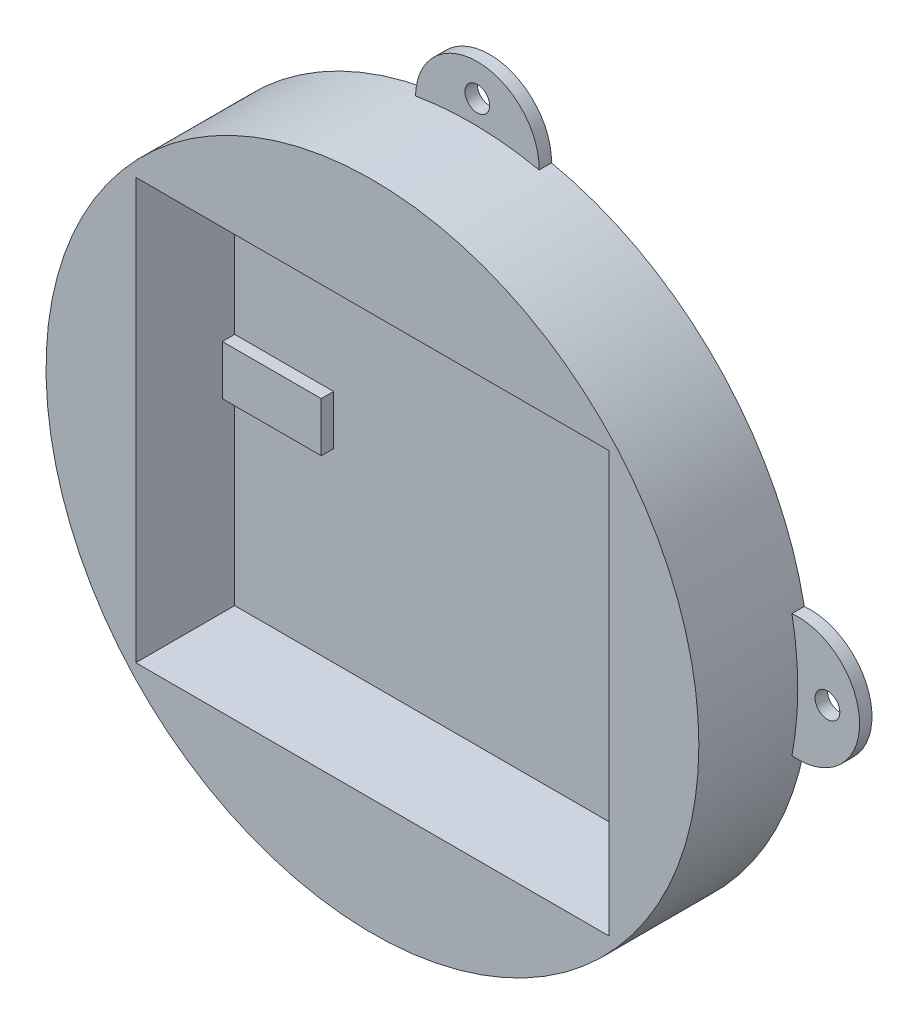
ISO-10303-21;
HEADER;
FILE_DESCRIPTION(('STEP AP214'),'2;1');
FILE_NAME('part.step','',(''),(''),'','','');
FILE_SCHEMA(('AUTOMOTIVE_DESIGN { 1 0 10303 214 1 1 1 1 }'));
ENDSEC;
DATA;
#1=APPLICATION_CONTEXT('core data for automotive mechanical design processes');
#2=APPLICATION_PROTOCOL_DEFINITION('international standard','automotive_design',2000,#1);
#3=PRODUCT_CONTEXT('',#1,'mechanical');
#4=PRODUCT('Part','Part','',(#3));
#5=PRODUCT_RELATED_PRODUCT_CATEGORY('part','',(#4));
#6=PRODUCT_DEFINITION_FORMATION('','',#4);
#7=PRODUCT_DEFINITION_CONTEXT('part definition',#1,'design');
#8=PRODUCT_DEFINITION('design','',#6,#7);
#9=PRODUCT_DEFINITION_SHAPE('','',#8);
#10=(LENGTH_UNIT() NAMED_UNIT(*) SI_UNIT(.MILLI.,.METRE.));
#11=(NAMED_UNIT(*) PLANE_ANGLE_UNIT() SI_UNIT($,.RADIAN.));
#12=(NAMED_UNIT(*) SI_UNIT($,.STERADIAN.) SOLID_ANGLE_UNIT());
#13=UNCERTAINTY_MEASURE_WITH_UNIT(LENGTH_MEASURE(1.E-05),#10,'distance_accuracy_value','');
#14=(GEOMETRIC_REPRESENTATION_CONTEXT(3) GLOBAL_UNCERTAINTY_ASSIGNED_CONTEXT((#13)) GLOBAL_UNIT_ASSIGNED_CONTEXT((#10,
#11,#12)) REPRESENTATION_CONTEXT('',''));
#15=CARTESIAN_POINT('',(0.,0.,0.));
#16=DIRECTION('',(0.,0.,1.));
#17=DIRECTION('',(1.,0.,0.));
#18=AXIS2_PLACEMENT_3D('',#15,#16,#17);
#19=CARTESIAN_POINT('',(0.,0.,5.));
#20=DIRECTION('',(0.,0.,1.));
#21=DIRECTION('',(1.,0.,0.));
#22=AXIS2_PLACEMENT_3D('',#19,#20,#21);
#23=PLANE('',#22);
#24=DIRECTION('',(-1.,0.,0.));
#25=VECTOR('',#24,1.);
#26=CARTESIAN_POINT('',(0.,-10.,5.));
#27=LINE('',#26,#25);
#28=CARTESIAN_POINT('',(-55.7100260608561,-10.,5.));
#29=VERTEX_POINT('',#28);
#30=CARTESIAN_POINT('',(-95.7100260608561,-10.,5.));
#31=VERTEX_POINT('',#30);
#32=EDGE_CURVE('E237',#29,#31,#27,.T.);
#33=ORIENTED_EDGE('',*,*,#32,.T.);
#34=DIRECTION('',(0.,1.,0.));
#35=VECTOR('',#34,1.);
#36=CARTESIAN_POINT('',(-95.7100260608561,0.,5.));
#37=LINE('',#36,#35);
#38=CARTESIAN_POINT('',(-95.7100260608561,-84.9917108395298,5.));
#39=VERTEX_POINT('',#38);
#40=EDGE_CURVE('E286',#39,#31,#37,.T.);
#41=ORIENTED_EDGE('',*,*,#40,.F.);
#42=DIRECTION('',(1.,0.,0.));
#43=VECTOR('',#42,1.);
#44=CARTESIAN_POINT('',(0.,-84.9917108395298,5.));
#45=LINE('',#44,#43);
#46=CARTESIAN_POINT('',(95.7100260608561,-84.9917108395298,5.));
#47=VERTEX_POINT('',#46);
#48=EDGE_CURVE('E294',#39,#47,#45,.T.);
#49=ORIENTED_EDGE('',*,*,#48,.T.);
#50=DIRECTION('',(0.,1.,0.));
#51=VECTOR('',#50,1.);
#52=CARTESIAN_POINT('',(95.7100260608561,0.,5.));
#53=LINE('',#52,#51);
#54=CARTESIAN_POINT('',(95.7100260608561,84.9917108395298,5.));
#55=VERTEX_POINT('',#54);
#56=EDGE_CURVE('E306',#47,#55,#53,.T.);
#57=ORIENTED_EDGE('',*,*,#56,.T.);
#58=DIRECTION('',(1.,0.,0.));
#59=VECTOR('',#58,1.);
#60=CARTESIAN_POINT('',(0.,84.9917108395298,5.));
#61=LINE('',#60,#59);
#62=CARTESIAN_POINT('',(-95.7100260608561,84.9917108395298,5.));
#63=VERTEX_POINT('',#62);
#64=EDGE_CURVE('E310',#63,#55,#61,.T.);
#65=ORIENTED_EDGE('',*,*,#64,.F.);
#66=CARTESIAN_POINT('',(-95.7100260608561,10.,5.));
#67=VERTEX_POINT('',#66);
#68=EDGE_CURVE('E280',#67,#63,#37,.T.);
#69=ORIENTED_EDGE('',*,*,#68,.F.);
#70=DIRECTION('',(1.,0.,0.));
#71=VECTOR('',#70,1.);
#72=CARTESIAN_POINT('',(0.,10.,5.));
#73=LINE('',#72,#71);
#74=CARTESIAN_POINT('',(-55.7100260608561,10.,5.));
#75=VERTEX_POINT('',#74);
#76=EDGE_CURVE('E246',#67,#75,#73,.T.);
#77=ORIENTED_EDGE('',*,*,#76,.T.);
#78=DIRECTION('',(0.,-1.,0.));
#79=VECTOR('',#78,1.);
#80=CARTESIAN_POINT('',(-55.7100260608561,0.,5.));
#81=LINE('',#80,#79);
#82=EDGE_CURVE('E261',#75,#29,#81,.T.);
#83=ORIENTED_EDGE('',*,*,#82,.T.);
#84=EDGE_LOOP('',(#33,#41,#49,#57,#65,#69,#77,#83));
#85=FACE_BOUND('',#84,.T.);
#86=ADVANCED_FACE('F47',(#85),#23,.T.);
#87=CARTESIAN_POINT('',(0.,0.,5.));
#88=DIRECTION('',(0.,0.,-1.));
#89=DIRECTION('',(-1.,0.,0.));
#90=AXIS2_PLACEMENT_3D('',#87,#88,#89);
#91=CYLINDRICAL_SURFACE('',#90,132.);
#92=CARTESIAN_POINT('',(0.,0.,0.));
#93=DIRECTION('',(0.,0.,1.));
#94=DIRECTION('',(1.,0.,0.));
#95=AXIS2_PLACEMENT_3D('',#92,#93,#94);
#96=CIRCLE('',#95,132.);
#97=CARTESIAN_POINT('',(-129.63397457454,-24.8803664765506,0.));
#98=VERTEX_POINT('',#97);
#99=CARTESIAN_POINT('',(-22.5914036564789,-130.052406670657,0.));
#100=VERTEX_POINT('',#99);
#101=EDGE_CURVE('E169',#98,#100,#96,.T.);
#102=ORIENTED_EDGE('',*,*,#101,.T.);
#103=DIRECTION('',(0.,0.,-1.));
#104=VECTOR('',#103,1.);
#105=CARTESIAN_POINT('',(-22.5914036564789,-130.052406670657,2.5));
#106=LINE('',#105,#104);
#107=CARTESIAN_POINT('',(-22.5914036564789,-130.052406670657,5.));
#108=VERTEX_POINT('',#107);
#109=EDGE_CURVE('E63',#100,#108,#106,.F.);
#110=ORIENTED_EDGE('',*,*,#109,.T.);
#111=CARTESIAN_POINT('',(0.,0.,5.));
#112=DIRECTION('',(0.,0.,-1.));
#113=DIRECTION('',(-1.,0.,0.));
#114=AXIS2_PLACEMENT_3D('',#111,#112,#113);
#115=CIRCLE('',#114,132.);
#116=CARTESIAN_POINT('',(27.3999910484909,-129.124902673894,5.));
#117=VERTEX_POINT('',#116);
#118=EDGE_CURVE('E11',#117,#108,#115,.T.);
#119=ORIENTED_EDGE('',*,*,#118,.F.);
#120=DIRECTION('',(0.,0.,-1.));
#121=VECTOR('',#120,1.);
#122=CARTESIAN_POINT('',(27.3999910484909,-129.124902673894,2.5));
#123=LINE('',#122,#121);
#124=CARTESIAN_POINT('',(27.3999910484909,-129.124902673894,0.));
#125=VERTEX_POINT('',#124);
#126=EDGE_CURVE('E207',#117,#125,#123,.T.);
#127=ORIENTED_EDGE('',*,*,#126,.T.);
#128=CARTESIAN_POINT('',(129.632575757576,-24.8876536149229,0.));
#129=VERTEX_POINT('',#128);
#130=EDGE_CURVE('E330',#125,#129,#96,.T.);
#131=ORIENTED_EDGE('',*,*,#130,.T.);
#132=DIRECTION('',(0.,0.,-1.));
#133=VECTOR('',#132,1.);
#134=CARTESIAN_POINT('',(129.632575757576,-24.8876536149229,5.));
#135=LINE('',#134,#133);
#136=CARTESIAN_POINT('',(129.632575757576,-24.8876536149229,5.));
#137=VERTEX_POINT('',#136);
#138=EDGE_CURVE('E233',#137,#129,#135,.T.);
#139=ORIENTED_EDGE('',*,*,#138,.F.);
#140=CARTESIAN_POINT('',(0.,0.,5.));
#141=DIRECTION('',(0.,0.,-1.));
#142=DIRECTION('',(-1.,0.,0.));
#143=AXIS2_PLACEMENT_3D('',#140,#141,#142);
#144=CIRCLE('',#143,132.);
#145=CARTESIAN_POINT('',(129.632575757576,24.8876536149229,5.));
#146=VERTEX_POINT('',#145);
#147=EDGE_CURVE('E217',#146,#137,#144,.T.);
#148=ORIENTED_EDGE('',*,*,#147,.F.);
#149=DIRECTION('',(0.,0.,-1.));
#150=VECTOR('',#149,1.);
#151=CARTESIAN_POINT('',(129.632575757576,24.8876536149229,5.));
#152=LINE('',#151,#150);
#153=CARTESIAN_POINT('',(129.632575757576,24.8876536149229,0.));
#154=VERTEX_POINT('',#153);
#155=EDGE_CURVE('E226',#146,#154,#152,.T.);
#156=ORIENTED_EDGE('',*,*,#155,.T.);
#157=CARTESIAN_POINT('',(27.3999910484927,129.124902673894,0.));
#158=VERTEX_POINT('',#157);
#159=EDGE_CURVE('E168',#154,#158,#96,.T.);
#160=ORIENTED_EDGE('',*,*,#159,.T.);
#161=DIRECTION('',(0.,0.,-1.));
#162=VECTOR('',#161,1.);
#163=CARTESIAN_POINT('',(27.3999910484927,129.124902673894,2.5));
#164=LINE('',#163,#162);
#165=CARTESIAN_POINT('',(27.3999910484927,129.124902673894,5.));
#166=VERTEX_POINT('',#165);
#167=EDGE_CURVE('E180',#158,#166,#164,.F.);
#168=ORIENTED_EDGE('',*,*,#167,.T.);
#169=CARTESIAN_POINT('',(0.,0.,5.));
#170=DIRECTION('',(0.,0.,-1.));
#171=DIRECTION('',(-1.,0.,0.));
#172=AXIS2_PLACEMENT_3D('',#169,#170,#171);
#173=CIRCLE('',#172,132.);
#174=CARTESIAN_POINT('',(-22.5914036564771,130.052406670658,5.));
#175=VERTEX_POINT('',#174);
#176=EDGE_CURVE('E175',#175,#166,#173,.T.);
#177=ORIENTED_EDGE('',*,*,#176,.F.);
#178=DIRECTION('',(0.,0.,-1.));
#179=VECTOR('',#178,1.);
#180=CARTESIAN_POINT('',(-22.5914036564771,130.052406670658,2.5));
#181=LINE('',#180,#179);
#182=CARTESIAN_POINT('',(-22.5914036564771,130.052406670658,0.));
#183=VERTEX_POINT('',#182);
#184=EDGE_CURVE('E172',#175,#183,#181,.T.);
#185=ORIENTED_EDGE('',*,*,#184,.T.);
#186=CARTESIAN_POINT('',(-129.63397457454,24.8803664765505,0.));
#187=VERTEX_POINT('',#186);
#188=EDGE_CURVE('E158',#183,#187,#96,.T.);
#189=ORIENTED_EDGE('',*,*,#188,.T.);
#190=DIRECTION('',(0.,0.,-1.));
#191=VECTOR('',#190,1.);
#192=CARTESIAN_POINT('',(-129.63397457454,24.8803664765505,2.5));
#193=LINE('',#192,#191);
#194=CARTESIAN_POINT('',(-129.63397457454,24.8803664765505,5.));
#195=VERTEX_POINT('',#194);
#196=EDGE_CURVE('E204',#187,#195,#193,.F.);
#197=ORIENTED_EDGE('',*,*,#196,.T.);
#198=CARTESIAN_POINT('',(0.,0.,5.));
#199=DIRECTION('',(0.,0.,-1.));
#200=DIRECTION('',(-1.,0.,0.));
#201=AXIS2_PLACEMENT_3D('',#198,#199,#200);
#202=CIRCLE('',#201,132.);
#203=CARTESIAN_POINT('',(-129.63397457454,-24.8803664765506,5.));
#204=VERTEX_POINT('',#203);
#205=EDGE_CURVE('E56',#204,#195,#202,.T.);
#206=ORIENTED_EDGE('',*,*,#205,.F.);
#207=DIRECTION('',(0.,0.,-1.));
#208=VECTOR('',#207,1.);
#209=CARTESIAN_POINT('',(-129.63397457454,-24.8803664765505,2.5));
#210=LINE('',#209,#208);
#211=EDGE_CURVE('E200',#204,#98,#210,.T.);
#212=ORIENTED_EDGE('',*,*,#211,.T.);
#213=EDGE_LOOP('',(#102,#110,#119,#127,#131,#139,#148,#156,#160,#168,#177,#185,#189,#197,#206,#212));
#214=FACE_BOUND('',#213,.T.);
#215=CARTESIAN_POINT('',(0.,0.,45.));
#216=DIRECTION('',(0.,0.,1.));
#217=DIRECTION('',(1.,0.,0.));
#218=AXIS2_PLACEMENT_3D('',#215,#216,#217);
#219=CIRCLE('',#218,132.);
#220=CARTESIAN_POINT('',(132.,0.,45.));
#221=VERTEX_POINT('',#220);
#222=EDGE_CURVE('E327',#221,#221,#219,.T.);
#223=ORIENTED_EDGE('',*,*,#222,.F.);
#224=EDGE_LOOP('',(#223));
#225=FACE_BOUND('',#224,.T.);
#226=ADVANCED_FACE('F49',(#214,#225),#91,.T.);
#227=CARTESIAN_POINT('',(0.,0.,0.));
#228=DIRECTION('',(0.,0.,1.));
#229=DIRECTION('',(1.,0.,0.));
#230=AXIS2_PLACEMENT_3D('',#227,#228,#229);
#231=PLANE('',#230);
#232=ORIENTED_EDGE('',*,*,#130,.F.);
#233=CARTESIAN_POINT('',(2.40442214372912,-129.59557785627,0.));
#234=DIRECTION('',(0.,0.,-1.));
#235=DIRECTION('',(0.,1.,0.));
#236=AXIS2_PLACEMENT_3D('',#233,#234,#235);
#237=CIRCLE('',#236,25.);
#238=EDGE_CURVE('E351',#125,#100,#237,.T.);
#239=ORIENTED_EDGE('',*,*,#238,.T.);
#240=ORIENTED_EDGE('',*,*,#101,.F.);
#241=CARTESIAN_POINT('',(-127.191155712541,0.,0.));
#242=DIRECTION('',(0.,0.,-1.));
#243=DIRECTION('',(1.,0.,0.));
#244=AXIS2_PLACEMENT_3D('',#241,#242,#243);
#245=CIRCLE('',#244,25.);
#246=EDGE_CURVE('E165',#98,#187,#245,.T.);
#247=ORIENTED_EDGE('',*,*,#246,.T.);
#248=ORIENTED_EDGE('',*,*,#188,.F.);
#249=CARTESIAN_POINT('',(2.40442214373091,129.59557785627,0.));
#250=DIRECTION('',(0.,0.,-1.));
#251=DIRECTION('',(0.,-1.,0.));
#252=AXIS2_PLACEMENT_3D('',#249,#250,#251);
#253=CIRCLE('',#252,25.);
#254=EDGE_CURVE('E163',#183,#158,#253,.T.);
#255=ORIENTED_EDGE('',*,*,#254,.T.);
#256=ORIENTED_EDGE('',*,*,#159,.F.);
#257=CARTESIAN_POINT('',(132.,0.,0.));
#258=DIRECTION('',(0.,0.,-1.));
#259=DIRECTION('',(-1.,0.,0.));
#260=AXIS2_PLACEMENT_3D('',#257,#258,#259);
#261=CIRCLE('',#260,25.);
#262=EDGE_CURVE('E218',#154,#129,#261,.T.);
#263=ORIENTED_EDGE('',*,*,#262,.T.);
#264=EDGE_LOOP('',(#232,#239,#240,#247,#248,#255,#256,#263));
#265=FACE_BOUND('',#264,.T.);
#266=CARTESIAN_POINT('',(144.,0.,0.));
#267=DIRECTION('',(0.,0.,-1.));
#268=DIRECTION('',(-1.,0.,0.));
#269=AXIS2_PLACEMENT_3D('',#266,#267,#268);
#270=CIRCLE('',#269,5.00000000000002);
#271=CARTESIAN_POINT('',(139.,0.,0.));
#272=VERTEX_POINT('',#271);
#273=EDGE_CURVE('E212',#272,#272,#270,.T.);
#274=ORIENTED_EDGE('',*,*,#273,.F.);
#275=EDGE_LOOP('',(#274));
#276=FACE_BOUND('',#275,.T.);
#277=CARTESIAN_POINT('',(2.40442214373104,141.59557785627,0.));
#278=DIRECTION('',(0.,0.,-1.));
#279=DIRECTION('',(0.,-1.,0.));
#280=AXIS2_PLACEMENT_3D('',#277,#278,#279);
#281=CIRCLE('',#280,5.00000000000002);
#282=CARTESIAN_POINT('',(2.40442214373099,136.59557785627,0.));
#283=VERTEX_POINT('',#282);
#284=EDGE_CURVE('E187',#283,#283,#281,.T.);
#285=ORIENTED_EDGE('',*,*,#284,.F.);
#286=EDGE_LOOP('',(#285));
#287=FACE_BOUND('',#286,.T.);
#288=CARTESIAN_POINT('',(-139.191155712541,0.,0.));
#289=DIRECTION('',(0.,0.,-1.));
#290=DIRECTION('',(1.,0.,0.));
#291=AXIS2_PLACEMENT_3D('',#288,#289,#290);
#292=CIRCLE('',#291,5.00000000000002);
#293=CARTESIAN_POINT('',(-134.191155712541,0.,0.));
#294=VERTEX_POINT('',#293);
#295=EDGE_CURVE('E357',#294,#294,#292,.T.);
#296=ORIENTED_EDGE('',*,*,#295,.F.);
#297=EDGE_LOOP('',(#296));
#298=FACE_BOUND('',#297,.T.);
#299=CARTESIAN_POINT('',(2.40442214372908,-141.59557785627,0.));
#300=DIRECTION('',(0.,0.,-1.));
#301=DIRECTION('',(0.,1.,0.));
#302=AXIS2_PLACEMENT_3D('',#299,#300,#301);
#303=CIRCLE('',#302,5.00000000000002);
#304=CARTESIAN_POINT('',(2.4044221437291,-136.59557785627,0.));
#305=VERTEX_POINT('',#304);
#306=EDGE_CURVE('E345',#305,#305,#303,.T.);
#307=ORIENTED_EDGE('',*,*,#306,.F.);
#308=EDGE_LOOP('',(#307));
#309=FACE_BOUND('',#308,.T.);
#310=ADVANCED_FACE('F160',(#265,#276,#287,#298,#309),#231,.F.);
#311=CARTESIAN_POINT('',(0.,0.,45.));
#312=DIRECTION('',(0.,0.,1.));
#313=DIRECTION('',(1.,0.,0.));
#314=AXIS2_PLACEMENT_3D('',#311,#312,#313);
#315=PLANE('',#314);
#316=ORIENTED_EDGE('',*,*,#222,.T.);
#317=EDGE_LOOP('',(#316));
#318=FACE_BOUND('',#317,.T.);
#319=DIRECTION('',(1.,0.,0.));
#320=VECTOR('',#319,1.);
#321=CARTESIAN_POINT('',(0.,-84.9917108395298,45.));
#322=LINE('',#321,#320);
#323=CARTESIAN_POINT('',(-95.7100260608561,-84.9917108395298,45.));
#324=VERTEX_POINT('',#323);
#325=CARTESIAN_POINT('',(95.7100260608561,-84.9917108395298,45.));
#326=VERTEX_POINT('',#325);
#327=EDGE_CURVE('E285',#324,#326,#322,.T.);
#328=ORIENTED_EDGE('',*,*,#327,.F.);
#329=DIRECTION('',(0.,1.,0.));
#330=VECTOR('',#329,1.);
#331=CARTESIAN_POINT('',(-95.7100260608561,0.,45.));
#332=LINE('',#331,#330);
#333=CARTESIAN_POINT('',(-95.7100260608561,84.9917108395298,45.));
#334=VERTEX_POINT('',#333);
#335=EDGE_CURVE('E281',#324,#334,#332,.T.);
#336=ORIENTED_EDGE('',*,*,#335,.T.);
#337=DIRECTION('',(1.,0.,0.));
#338=VECTOR('',#337,1.);
#339=CARTESIAN_POINT('',(0.,84.9917108395298,45.));
#340=LINE('',#339,#338);
#341=CARTESIAN_POINT('',(95.7100260608561,84.9917108395298,45.));
#342=VERTEX_POINT('',#341);
#343=EDGE_CURVE('E314',#334,#342,#340,.T.);
#344=ORIENTED_EDGE('',*,*,#343,.T.);
#345=DIRECTION('',(0.,1.,0.));
#346=VECTOR('',#345,1.);
#347=CARTESIAN_POINT('',(95.7100260608561,0.,45.));
#348=LINE('',#347,#346);
#349=EDGE_CURVE('E298',#326,#342,#348,.T.);
#350=ORIENTED_EDGE('',*,*,#349,.F.);
#351=EDGE_LOOP('',(#328,#336,#344,#350));
#352=FACE_BOUND('',#351,.T.);
#353=ADVANCED_FACE('F388',(#318,#352),#315,.T.);
#354=CARTESIAN_POINT('',(0.,84.9917108395298,45.));
#355=DIRECTION('',(0.,1.,0.));
#356=DIRECTION('',(0.,0.,1.));
#357=AXIS2_PLACEMENT_3D('',#354,#355,#356);
#358=PLANE('',#357);
#359=ORIENTED_EDGE('',*,*,#64,.T.);
#360=DIRECTION('',(0.,0.,-1.));
#361=VECTOR('',#360,1.);
#362=CARTESIAN_POINT('',(95.7100260608561,84.9917108395298,45.));
#363=LINE('',#362,#361);
#364=EDGE_CURVE('E317',#342,#55,#363,.T.);
#365=ORIENTED_EDGE('',*,*,#364,.F.);
#366=ORIENTED_EDGE('',*,*,#343,.F.);
#367=DIRECTION('',(0.,0.,-1.));
#368=VECTOR('',#367,1.);
#369=CARTESIAN_POINT('',(-95.7100260608561,84.9917108395298,45.));
#370=LINE('',#369,#368);
#371=EDGE_CURVE('E323',#334,#63,#370,.T.);
#372=ORIENTED_EDGE('',*,*,#371,.T.);
#373=EDGE_LOOP('',(#359,#365,#366,#372));
#374=FACE_BOUND('',#373,.T.);
#375=ADVANCED_FACE('F395',(#374),#358,.F.);
#376=CARTESIAN_POINT('',(95.7100260608561,0.,45.));
#377=DIRECTION('',(-1.,0.,0.));
#378=DIRECTION('',(0.,0.,1.));
#379=AXIS2_PLACEMENT_3D('',#376,#377,#378);
#380=PLANE('',#379);
#381=ORIENTED_EDGE('',*,*,#56,.F.);
#382=DIRECTION('',(0.,0.,-1.));
#383=VECTOR('',#382,1.);
#384=CARTESIAN_POINT('',(95.7100260608561,-84.9917108395298,45.));
#385=LINE('',#384,#383);
#386=EDGE_CURVE('E302',#326,#47,#385,.T.);
#387=ORIENTED_EDGE('',*,*,#386,.F.);
#388=ORIENTED_EDGE('',*,*,#349,.T.);
#389=ORIENTED_EDGE('',*,*,#364,.T.);
#390=EDGE_LOOP('',(#381,#387,#388,#389));
#391=FACE_BOUND('',#390,.T.);
#392=ADVANCED_FACE('F400',(#391),#380,.T.);
#393=CARTESIAN_POINT('',(0.,-84.9917108395298,45.));
#394=DIRECTION('',(0.,1.,0.));
#395=DIRECTION('',(0.,0.,1.));
#396=AXIS2_PLACEMENT_3D('',#393,#394,#395);
#397=PLANE('',#396);
#398=ORIENTED_EDGE('',*,*,#48,.F.);
#399=DIRECTION('',(0.,0.,-1.));
#400=VECTOR('',#399,1.);
#401=CARTESIAN_POINT('',(-95.7100260608561,-84.9917108395298,45.));
#402=LINE('',#401,#400);
#403=EDGE_CURVE('E290',#324,#39,#402,.T.);
#404=ORIENTED_EDGE('',*,*,#403,.F.);
#405=ORIENTED_EDGE('',*,*,#327,.T.);
#406=ORIENTED_EDGE('',*,*,#386,.T.);
#407=EDGE_LOOP('',(#398,#404,#405,#406));
#408=FACE_BOUND('',#407,.T.);
#409=ADVANCED_FACE('F416',(#408),#397,.T.);
#410=CARTESIAN_POINT('',(-95.7100260608561,0.,45.));
#411=DIRECTION('',(-1.,0.,0.));
#412=DIRECTION('',(0.,0.,1.));
#413=AXIS2_PLACEMENT_3D('',#410,#411,#412);
#414=PLANE('',#413);
#415=ORIENTED_EDGE('',*,*,#40,.T.);
#416=DIRECTION('',(0.,0.,-1.));
#417=VECTOR('',#416,1.);
#418=CARTESIAN_POINT('',(-95.7100260608561,-10.,10.));
#419=LINE('',#418,#417);
#420=CARTESIAN_POINT('',(-95.7100260608561,-10.,10.));
#421=VERTEX_POINT('',#420);
#422=EDGE_CURVE('E257',#421,#31,#419,.T.);
#423=ORIENTED_EDGE('',*,*,#422,.F.);
#424=DIRECTION('',(0.,-1.,0.));
#425=VECTOR('',#424,1.);
#426=CARTESIAN_POINT('',(-95.7100260608561,0.,10.));
#427=LINE('',#426,#425);
#428=CARTESIAN_POINT('',(-95.7100260608561,10.,10.));
#429=VERTEX_POINT('',#428);
#430=EDGE_CURVE('E254',#429,#421,#427,.T.);
#431=ORIENTED_EDGE('',*,*,#430,.F.);
#432=DIRECTION('',(0.,0.,-1.));
#433=VECTOR('',#432,1.);
#434=CARTESIAN_POINT('',(-95.7100260608561,10.,10.));
#435=LINE('',#434,#433);
#436=EDGE_CURVE('E270',#429,#67,#435,.T.);
#437=ORIENTED_EDGE('',*,*,#436,.T.);
#438=ORIENTED_EDGE('',*,*,#68,.T.);
#439=ORIENTED_EDGE('',*,*,#371,.F.);
#440=ORIENTED_EDGE('',*,*,#335,.F.);
#441=ORIENTED_EDGE('',*,*,#403,.T.);
#442=EDGE_LOOP('',(#415,#423,#431,#437,#438,#439,#440,#441));
#443=FACE_BOUND('',#442,.T.);
#444=ADVANCED_FACE('F410',(#443),#414,.F.);
#445=CARTESIAN_POINT('',(0.,-10.,10.));
#446=DIRECTION('',(0.,-1.,0.));
#447=DIRECTION('',(0.,0.,-1.));
#448=AXIS2_PLACEMENT_3D('',#445,#446,#447);
#449=PLANE('',#448);
#450=ORIENTED_EDGE('',*,*,#32,.F.);
#451=DIRECTION('',(0.,0.,-1.));
#452=VECTOR('',#451,1.);
#453=CARTESIAN_POINT('',(-55.7100260608561,-10.,10.));
#454=LINE('',#453,#452);
#455=CARTESIAN_POINT('',(-55.7100260608561,-10.,10.));
#456=VERTEX_POINT('',#455);
#457=EDGE_CURVE('E277',#456,#29,#454,.T.);
#458=ORIENTED_EDGE('',*,*,#457,.F.);
#459=DIRECTION('',(-1.,0.,0.));
#460=VECTOR('',#459,1.);
#461=CARTESIAN_POINT('',(0.,-10.,10.));
#462=LINE('',#461,#460);
#463=EDGE_CURVE('E241',#456,#421,#462,.T.);
#464=ORIENTED_EDGE('',*,*,#463,.T.);
#465=ORIENTED_EDGE('',*,*,#422,.T.);
#466=EDGE_LOOP('',(#450,#458,#464,#465));
#467=FACE_BOUND('',#466,.T.);
#468=ADVANCED_FACE('F421',(#467),#449,.T.);
#469=CARTESIAN_POINT('',(-55.7100260608561,0.,10.));
#470=DIRECTION('',(1.,0.,0.));
#471=DIRECTION('',(0.,0.,-1.));
#472=AXIS2_PLACEMENT_3D('',#469,#470,#471);
#473=PLANE('',#472);
#474=ORIENTED_EDGE('',*,*,#82,.F.);
#475=DIRECTION('',(0.,0.,-1.));
#476=VECTOR('',#475,1.);
#477=CARTESIAN_POINT('',(-55.7100260608561,10.,10.));
#478=LINE('',#477,#476);
#479=CARTESIAN_POINT('',(-55.7100260608561,10.,10.));
#480=VERTEX_POINT('',#479);
#481=EDGE_CURVE('E274',#480,#75,#478,.T.);
#482=ORIENTED_EDGE('',*,*,#481,.F.);
#483=DIRECTION('',(0.,-1.,0.));
#484=VECTOR('',#483,1.);
#485=CARTESIAN_POINT('',(-55.7100260608561,0.,10.));
#486=LINE('',#485,#484);
#487=EDGE_CURVE('E245',#480,#456,#486,.T.);
#488=ORIENTED_EDGE('',*,*,#487,.T.);
#489=ORIENTED_EDGE('',*,*,#457,.T.);
#490=EDGE_LOOP('',(#474,#482,#488,#489));
#491=FACE_BOUND('',#490,.T.);
#492=ADVANCED_FACE('F428',(#491),#473,.T.);
#493=CARTESIAN_POINT('',(0.,10.,10.));
#494=DIRECTION('',(0.,1.,0.));
#495=DIRECTION('',(0.,0.,1.));
#496=AXIS2_PLACEMENT_3D('',#493,#494,#495);
#497=PLANE('',#496);
#498=ORIENTED_EDGE('',*,*,#76,.F.);
#499=ORIENTED_EDGE('',*,*,#436,.F.);
#500=DIRECTION('',(1.,0.,0.));
#501=VECTOR('',#500,1.);
#502=CARTESIAN_POINT('',(0.,10.,10.));
#503=LINE('',#502,#501);
#504=EDGE_CURVE('E250',#429,#480,#503,.T.);
#505=ORIENTED_EDGE('',*,*,#504,.T.);
#506=ORIENTED_EDGE('',*,*,#481,.T.);
#507=EDGE_LOOP('',(#498,#499,#505,#506));
#508=FACE_BOUND('',#507,.T.);
#509=ADVANCED_FACE('F430',(#508),#497,.T.);
#510=CARTESIAN_POINT('',(0.,0.,10.));
#511=DIRECTION('',(0.,0.,1.));
#512=DIRECTION('',(1.,0.,0.));
#513=AXIS2_PLACEMENT_3D('',#510,#511,#512);
#514=PLANE('',#513);
#515=ORIENTED_EDGE('',*,*,#463,.F.);
#516=ORIENTED_EDGE('',*,*,#487,.F.);
#517=ORIENTED_EDGE('',*,*,#504,.F.);
#518=ORIENTED_EDGE('',*,*,#430,.T.);
#519=EDGE_LOOP('',(#515,#516,#517,#518));
#520=FACE_BOUND('',#519,.T.);
#521=ADVANCED_FACE('F425',(#520),#514,.T.);
#522=CARTESIAN_POINT('',(144.,0.,5.));
#523=DIRECTION('',(0.,0.,-1.));
#524=DIRECTION('',(-1.,0.,0.));
#525=AXIS2_PLACEMENT_3D('',#522,#523,#524);
#526=CYLINDRICAL_SURFACE('',#525,5.00000000000002);
#527=CARTESIAN_POINT('',(144.,0.,5.));
#528=DIRECTION('',(0.,0.,-1.));
#529=DIRECTION('',(-1.,0.,0.));
#530=AXIS2_PLACEMENT_3D('',#527,#528,#529);
#531=CIRCLE('',#530,5.00000000000002);
#532=CARTESIAN_POINT('',(139.,0.,5.));
#533=VERTEX_POINT('',#532);
#534=EDGE_CURVE('E213',#533,#533,#531,.T.);
#535=ORIENTED_EDGE('',*,*,#534,.F.);
#536=EDGE_LOOP('',(#535));
#537=FACE_BOUND('',#536,.T.);
#538=ORIENTED_EDGE('',*,*,#273,.T.);
#539=EDGE_LOOP('',(#538));
#540=FACE_BOUND('',#539,.T.);
#541=ADVANCED_FACE('F438',(#537,#540),#526,.F.);
#542=CARTESIAN_POINT('',(132.,0.,5.));
#543=DIRECTION('',(0.,0.,-1.));
#544=DIRECTION('',(-1.,0.,0.));
#545=AXIS2_PLACEMENT_3D('',#542,#543,#544);
#546=CYLINDRICAL_SURFACE('',#545,25.);
#547=ORIENTED_EDGE('',*,*,#262,.F.);
#548=ORIENTED_EDGE('',*,*,#155,.F.);
#549=CARTESIAN_POINT('',(132.,0.,5.));
#550=DIRECTION('',(0.,0.,-1.));
#551=DIRECTION('',(-1.,0.,0.));
#552=AXIS2_PLACEMENT_3D('',#549,#550,#551);
#553=CIRCLE('',#552,25.);
#554=EDGE_CURVE('E222',#146,#137,#553,.T.);
#555=ORIENTED_EDGE('',*,*,#554,.T.);
#556=ORIENTED_EDGE('',*,*,#138,.T.);
#557=EDGE_LOOP('',(#547,#548,#555,#556));
#558=FACE_BOUND('',#557,.T.);
#559=ADVANCED_FACE('F522',(#558),#546,.T.);
#560=CARTESIAN_POINT('',(0.,0.,5.));
#561=DIRECTION('',(0.,0.,-1.));
#562=DIRECTION('',(-1.,0.,0.));
#563=AXIS2_PLACEMENT_3D('',#560,#561,#562);
#564=PLANE('',#563);
#565=ORIENTED_EDGE('',*,*,#534,.T.);
#566=EDGE_LOOP('',(#565));
#567=FACE_BOUND('',#566,.T.);
#568=ORIENTED_EDGE('',*,*,#147,.T.);
#569=ORIENTED_EDGE('',*,*,#554,.F.);
#570=EDGE_LOOP('',(#568,#569));
#571=FACE_BOUND('',#570,.T.);
#572=ADVANCED_FACE('F530',(#567,#571),#564,.F.);
#573=CARTESIAN_POINT('',(2.40442214373091,129.59557785627,5.));
#574=DIRECTION('',(0.,0.,-1.));
#575=DIRECTION('',(-1.,0.,0.));
#576=AXIS2_PLACEMENT_3D('',#573,#574,#575);
#577=CYLINDRICAL_SURFACE('',#576,25.);
#578=ORIENTED_EDGE('',*,*,#167,.F.);
#579=ORIENTED_EDGE('',*,*,#254,.F.);
#580=ORIENTED_EDGE('',*,*,#184,.F.);
#581=CARTESIAN_POINT('',(2.40442214373091,129.59557785627,5.));
#582=DIRECTION('',(0.,0.,-1.));
#583=DIRECTION('',(0.,-1.,0.));
#584=AXIS2_PLACEMENT_3D('',#581,#582,#583);
#585=CIRCLE('',#584,25.);
#586=EDGE_CURVE('E192',#175,#166,#585,.T.);
#587=ORIENTED_EDGE('',*,*,#586,.T.);
#588=EDGE_LOOP('',(#578,#579,#580,#587));
#589=FACE_BOUND('',#588,.T.);
#590=ADVANCED_FACE('F184',(#589),#577,.T.);
#591=CARTESIAN_POINT('',(2.40442214373104,141.59557785627,5.));
#592=DIRECTION('',(0.,0.,-1.));
#593=DIRECTION('',(-1.,0.,0.));
#594=AXIS2_PLACEMENT_3D('',#591,#592,#593);
#595=CYLINDRICAL_SURFACE('',#594,5.00000000000002);
#596=CARTESIAN_POINT('',(2.40442214373104,141.59557785627,5.));
#597=DIRECTION('',(0.,0.,-1.));
#598=DIRECTION('',(0.,-1.,0.));
#599=AXIS2_PLACEMENT_3D('',#596,#597,#598);
#600=CIRCLE('',#599,5.00000000000002);
#601=CARTESIAN_POINT('',(2.40442214373099,136.59557785627,5.));
#602=VERTEX_POINT('',#601);
#603=EDGE_CURVE('E186',#602,#602,#600,.T.);
#604=ORIENTED_EDGE('',*,*,#603,.F.);
#605=EDGE_LOOP('',(#604));
#606=FACE_BOUND('',#605,.T.);
#607=ORIENTED_EDGE('',*,*,#284,.T.);
#608=EDGE_LOOP('',(#607));
#609=FACE_BOUND('',#608,.T.);
#610=ADVANCED_FACE('F366',(#606,#609),#595,.F.);
#611=CARTESIAN_POINT('',(2.40442214372953,-2.40442214372958,5.));
#612=DIRECTION('',(0.,0.,-1.));
#613=DIRECTION('',(0.,-1.,0.));
#614=AXIS2_PLACEMENT_3D('',#611,#612,#613);
#615=PLANE('',#614);
#616=ORIENTED_EDGE('',*,*,#603,.T.);
#617=EDGE_LOOP('',(#616));
#618=FACE_BOUND('',#617,.T.);
#619=ORIENTED_EDGE('',*,*,#586,.F.);
#620=ORIENTED_EDGE('',*,*,#176,.T.);
#621=EDGE_LOOP('',(#619,#620));
#622=FACE_BOUND('',#621,.T.);
#623=ADVANCED_FACE('F364',(#618,#622),#615,.F.);
#624=CARTESIAN_POINT('',(-127.191155712541,0.,5.));
#625=DIRECTION('',(0.,0.,-1.));
#626=DIRECTION('',(-1.,0.,0.));
#627=AXIS2_PLACEMENT_3D('',#624,#625,#626);
#628=CYLINDRICAL_SURFACE('',#627,25.);
#629=ORIENTED_EDGE('',*,*,#196,.F.);
#630=ORIENTED_EDGE('',*,*,#246,.F.);
#631=ORIENTED_EDGE('',*,*,#211,.F.);
#632=CARTESIAN_POINT('',(-127.191155712541,0.,5.));
#633=DIRECTION('',(0.,0.,-1.));
#634=DIRECTION('',(1.,0.,0.));
#635=AXIS2_PLACEMENT_3D('',#632,#633,#634);
#636=CIRCLE('',#635,25.);
#637=EDGE_CURVE('E340',#204,#195,#636,.T.);
#638=ORIENTED_EDGE('',*,*,#637,.T.);
#639=EDGE_LOOP('',(#629,#630,#631,#638));
#640=FACE_BOUND('',#639,.T.);
#641=ADVANCED_FACE('F343',(#640),#628,.T.);
#642=CARTESIAN_POINT('',(-139.191155712541,0.,5.));
#643=DIRECTION('',(0.,0.,-1.));
#644=DIRECTION('',(-1.,0.,0.));
#645=AXIS2_PLACEMENT_3D('',#642,#643,#644);
#646=CYLINDRICAL_SURFACE('',#645,5.00000000000002);
#647=CARTESIAN_POINT('',(-139.191155712541,0.,5.));
#648=DIRECTION('',(0.,0.,-1.));
#649=DIRECTION('',(1.,0.,0.));
#650=AXIS2_PLACEMENT_3D('',#647,#648,#649);
#651=CIRCLE('',#650,5.00000000000002);
#652=CARTESIAN_POINT('',(-134.191155712541,0.,5.));
#653=VERTEX_POINT('',#652);
#654=EDGE_CURVE('E346',#653,#653,#651,.T.);
#655=ORIENTED_EDGE('',*,*,#654,.F.);
#656=EDGE_LOOP('',(#655));
#657=FACE_BOUND('',#656,.T.);
#658=ORIENTED_EDGE('',*,*,#295,.T.);
#659=EDGE_LOOP('',(#658));
#660=FACE_BOUND('',#659,.T.);
#661=ADVANCED_FACE('F373',(#657,#660),#646,.F.);
#662=CARTESIAN_POINT('',(4.80884428745913,0.,5.));
#663=DIRECTION('',(0.,0.,-1.));
#664=DIRECTION('',(1.,0.,0.));
#665=AXIS2_PLACEMENT_3D('',#662,#663,#664);
#666=PLANE('',#665);
#667=ORIENTED_EDGE('',*,*,#654,.T.);
#668=EDGE_LOOP('',(#667));
#669=FACE_BOUND('',#668,.T.);
#670=ORIENTED_EDGE('',*,*,#637,.F.);
#671=ORIENTED_EDGE('',*,*,#205,.T.);
#672=EDGE_LOOP('',(#670,#671));
#673=FACE_BOUND('',#672,.T.);
#674=ADVANCED_FACE('F339',(#669,#673),#666,.F.);
#675=CARTESIAN_POINT('',(2.40442214372912,-129.59557785627,5.));
#676=DIRECTION('',(0.,0.,-1.));
#677=DIRECTION('',(-1.,0.,0.));
#678=AXIS2_PLACEMENT_3D('',#675,#676,#677);
#679=CYLINDRICAL_SURFACE('',#678,25.);
#680=ORIENTED_EDGE('',*,*,#109,.F.);
#681=ORIENTED_EDGE('',*,*,#238,.F.);
#682=ORIENTED_EDGE('',*,*,#126,.F.);
#683=CARTESIAN_POINT('',(2.40442214372912,-129.59557785627,5.));
#684=DIRECTION('',(0.,0.,-1.));
#685=DIRECTION('',(0.,1.,0.));
#686=AXIS2_PLACEMENT_3D('',#683,#684,#685);
#687=CIRCLE('',#686,25.);
#688=EDGE_CURVE('E181',#117,#108,#687,.T.);
#689=ORIENTED_EDGE('',*,*,#688,.T.);
#690=EDGE_LOOP('',(#680,#681,#682,#689));
#691=FACE_BOUND('',#690,.T.);
#692=ADVANCED_FACE('F603',(#691),#679,.T.);
#693=CARTESIAN_POINT('',(2.40442214372908,-141.59557785627,5.));
#694=DIRECTION('',(0.,0.,-1.));
#695=DIRECTION('',(-1.,0.,0.));
#696=AXIS2_PLACEMENT_3D('',#693,#694,#695);
#697=CYLINDRICAL_SURFACE('',#696,5.00000000000002);
#698=CARTESIAN_POINT('',(2.40442214372908,-141.59557785627,5.));
#699=DIRECTION('',(0.,0.,-1.));
#700=DIRECTION('',(0.,1.,0.));
#701=AXIS2_PLACEMENT_3D('',#698,#699,#700);
#702=CIRCLE('',#701,5.00000000000002);
#703=CARTESIAN_POINT('',(2.4044221437291,-136.59557785627,5.));
#704=VERTEX_POINT('',#703);
#705=EDGE_CURVE('E642',#704,#704,#702,.T.);
#706=ORIENTED_EDGE('',*,*,#705,.F.);
#707=EDGE_LOOP('',(#706));
#708=FACE_BOUND('',#707,.T.);
#709=ORIENTED_EDGE('',*,*,#306,.T.);
#710=EDGE_LOOP('',(#709));
#711=FACE_BOUND('',#710,.T.);
#712=ADVANCED_FACE('F612',(#708,#711),#697,.F.);
#713=CARTESIAN_POINT('',(2.40442214372958,2.40442214372956,5.));
#714=DIRECTION('',(0.,0.,-1.));
#715=DIRECTION('',(0.,1.,0.));
#716=AXIS2_PLACEMENT_3D('',#713,#714,#715);
#717=PLANE('',#716);
#718=ORIENTED_EDGE('',*,*,#705,.T.);
#719=EDGE_LOOP('',(#718));
#720=FACE_BOUND('',#719,.T.);
#721=ORIENTED_EDGE('',*,*,#688,.F.);
#722=ORIENTED_EDGE('',*,*,#118,.T.);
#723=EDGE_LOOP('',(#721,#722));
#724=FACE_BOUND('',#723,.T.);
#725=ADVANCED_FACE('F621',(#720,#724),#717,.F.);
#726=CLOSED_SHELL('',(#86,#226,#310,#353,#375,#392,#409,#444,#468,#492,#509,#521,#541,#559,#572,
#590,#610,#623,#641,#661,#674,#692,#712,#725));
#727=MANIFOLD_SOLID_BREP('B2',#726);
#728=ADVANCED_BREP_SHAPE_REPRESENTATION('',(#18,#727),#14);
#729=SHAPE_DEFINITION_REPRESENTATION(#9,#728);
ENDSEC;
END-ISO-10303-21;
